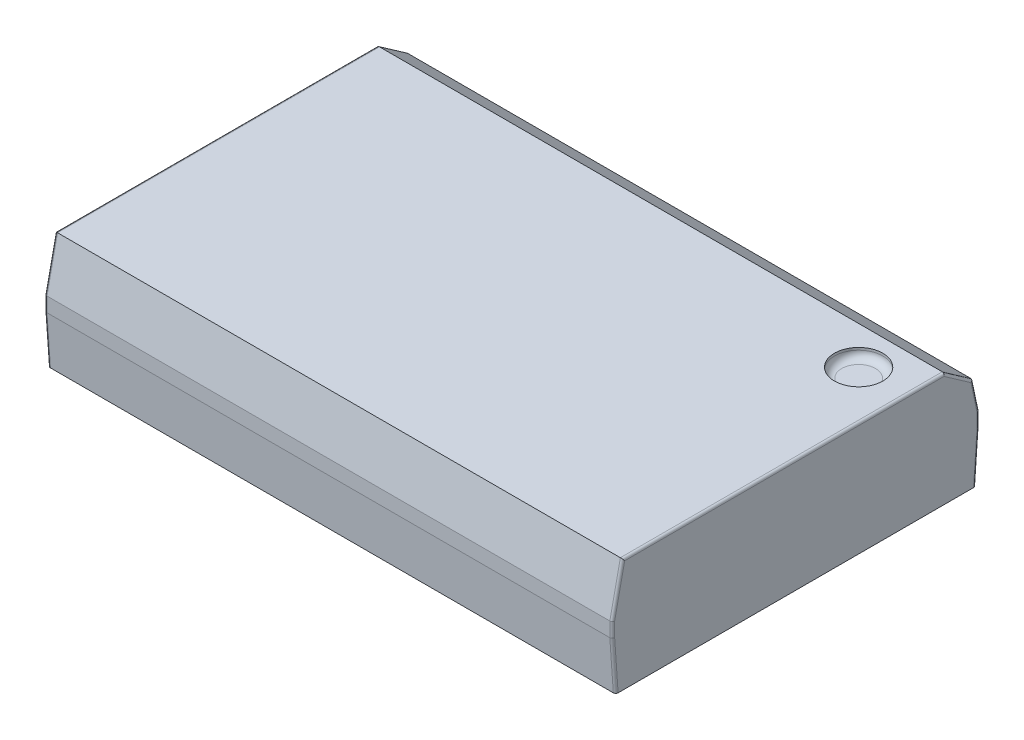
ISO-10303-21;
HEADER;
FILE_DESCRIPTION(('STEP AP214'),'2;1');
FILE_NAME('part.step','',(''),(''),'','','');
FILE_SCHEMA(('AUTOMOTIVE_DESIGN { 1 0 10303 214 1 1 1 1 }'));
ENDSEC;
DATA;
#1=APPLICATION_CONTEXT('core data for automotive mechanical design processes');
#2=APPLICATION_PROTOCOL_DEFINITION('international standard','automotive_design',2000,#1);
#3=PRODUCT_CONTEXT('',#1,'mechanical');
#4=PRODUCT('Part','Part','',(#3));
#5=PRODUCT_RELATED_PRODUCT_CATEGORY('part','',(#4));
#6=PRODUCT_DEFINITION_FORMATION('','',#4);
#7=PRODUCT_DEFINITION_CONTEXT('part definition',#1,'design');
#8=PRODUCT_DEFINITION('design','',#6,#7);
#9=PRODUCT_DEFINITION_SHAPE('','',#8);
#10=(LENGTH_UNIT() NAMED_UNIT(*) SI_UNIT(.MILLI.,.METRE.));
#11=(NAMED_UNIT(*) PLANE_ANGLE_UNIT() SI_UNIT($,.RADIAN.));
#12=(NAMED_UNIT(*) SI_UNIT($,.STERADIAN.) SOLID_ANGLE_UNIT());
#13=UNCERTAINTY_MEASURE_WITH_UNIT(LENGTH_MEASURE(1.E-05),#10,'distance_accuracy_value','');
#14=(GEOMETRIC_REPRESENTATION_CONTEXT(3) GLOBAL_UNCERTAINTY_ASSIGNED_CONTEXT((#13)) GLOBAL_UNIT_ASSIGNED_CONTEXT((#10,
#11,#12)) REPRESENTATION_CONTEXT('',''));
#15=CARTESIAN_POINT('',(0.,0.,0.));
#16=DIRECTION('',(0.,0.,1.));
#17=DIRECTION('',(1.,0.,0.));
#18=AXIS2_PLACEMENT_3D('',#15,#16,#17);
#19=CARTESIAN_POINT('',(4.875,0.975,-2.3));
#20=DIRECTION('',(0.,1.,0.));
#21=DIRECTION('',(0.,0.,1.));
#22=AXIS2_PLACEMENT_3D('',#19,#20,#21);
#23=PLANE('',#22);
#24=CARTESIAN_POINT('',(4.875,0.975,-2.3));
#25=DIRECTION('',(0.,-1.,0.));
#26=DIRECTION('',(0.,0.,-1.));
#27=AXIS2_PLACEMENT_3D('',#24,#25,#26);
#28=CIRCLE('',#27,0.350000000000004);
#29=CARTESIAN_POINT('',(4.875,0.975,-1.95));
#30=VERTEX_POINT('',#29);
#31=CARTESIAN_POINT('',(4.875,0.975,-2.65));
#32=VERTEX_POINT('',#31);
#33=EDGE_CURVE('E294',#30,#32,#28,.F.);
#34=ORIENTED_EDGE('',*,*,#33,.T.);
#35=CARTESIAN_POINT('',(4.875,0.975,-2.3));
#36=DIRECTION('',(0.,-1.,0.));
#37=DIRECTION('',(0.,0.,1.));
#38=AXIS2_PLACEMENT_3D('',#35,#36,#37);
#39=CIRCLE('',#38,0.350000000000003);
#40=EDGE_CURVE('E296',#32,#30,#39,.F.);
#41=ORIENTED_EDGE('',*,*,#40,.T.);
#42=EDGE_LOOP('',(#34,#41));
#43=FACE_BOUND('',#42,.T.);
#44=ADVANCED_FACE('F17',(#43),#23,.T.);
#45=CARTESIAN_POINT('',(4.875,1.125,-2.3));
#46=DIRECTION('',(0.,1.,0.));
#47=DIRECTION('',(0.,0.,1.));
#48=AXIS2_PLACEMENT_3D('',#45,#46,#47);
#49=TOROIDAL_SURFACE('',#48,0.350000000000004,0.15);
#50=CARTESIAN_POINT('',(4.875,1.125,-2.3));
#51=DIRECTION('',(0.,1.,0.));
#52=DIRECTION('',(0.,0.,1.));
#53=AXIS2_PLACEMENT_3D('',#50,#51,#52);
#54=CIRCLE('',#53,0.500000000000003);
#55=CARTESIAN_POINT('',(4.875,1.125,-1.8));
#56=VERTEX_POINT('',#55);
#57=EDGE_CURVE('E213',#56,#56,#54,.T.);
#58=ORIENTED_EDGE('',*,*,#57,.T.);
#59=EDGE_LOOP('',(#58));
#60=FACE_BOUND('',#59,.T.);
#61=ORIENTED_EDGE('',*,*,#40,.F.);
#62=ORIENTED_EDGE('',*,*,#33,.F.);
#63=EDGE_LOOP('',(#61,#62));
#64=FACE_BOUND('',#63,.T.);
#65=ADVANCED_FACE('F217',(#60,#64),#49,.F.);
#66=CARTESIAN_POINT('',(4.875,0.975,-2.3));
#67=DIRECTION('',(0.,1.,0.));
#68=DIRECTION('',(0.,0.,1.));
#69=AXIS2_PLACEMENT_3D('',#66,#67,#68);
#70=CYLINDRICAL_SURFACE('',#69,0.500000000000003);
#71=CARTESIAN_POINT('',(4.875,1.175,-2.3));
#72=DIRECTION('',(0.,1.,0.));
#73=DIRECTION('',(0.,0.,1.));
#74=AXIS2_PLACEMENT_3D('',#71,#72,#73);
#75=CIRCLE('',#74,0.500000000000003);
#76=CARTESIAN_POINT('',(4.875,1.175,-1.8));
#77=VERTEX_POINT('',#76);
#78=EDGE_CURVE('E202',#77,#77,#75,.F.);
#79=ORIENTED_EDGE('',*,*,#78,.F.);
#80=EDGE_LOOP('',(#79));
#81=FACE_BOUND('',#80,.T.);
#82=ORIENTED_EDGE('',*,*,#57,.F.);
#83=EDGE_LOOP('',(#82));
#84=FACE_BOUND('',#83,.T.);
#85=ADVANCED_FACE('F221',(#81,#84),#70,.F.);
#86=CARTESIAN_POINT('',(-5.875,1.175,-3.08212952428822));
#87=DIRECTION('',(0.,0.819152044288992,-0.573576436351045));
#88=DIRECTION('',(0.,0.573576436351045,0.819152044288992));
#89=AXIS2_PLACEMENT_3D('',#86,#87,#88);
#90=PLANE('',#89);
#91=DIRECTION('',(1.,0.,0.));
#92=VECTOR('',#91,1.);
#93=CARTESIAN_POINT('',(-5.875,1.175,-3.08212952428822));
#94=LINE('',#93,#92);
#95=CARTESIAN_POINT('',(5.825,1.175,-3.08212952428822));
#96=VERTEX_POINT('',#95);
#97=CARTESIAN_POINT('',(-5.825,1.175,-3.08212952428822));
#98=VERTEX_POINT('',#97);
#99=EDGE_CURVE('E199',#96,#98,#94,.F.);
#100=ORIENTED_EDGE('',*,*,#99,.F.);
#101=DIRECTION('',(0.,0.573576436351045,0.819152044288992));
#102=VECTOR('',#101,1.);
#103=CARTESIAN_POINT('',(5.825,1.175,-3.08212952428822));
#104=LINE('',#103,#102);
#105=CARTESIAN_POINT('',(5.825,0.763677592272504,-3.66955880101262));
#106=VERTEX_POINT('',#105);
#107=EDGE_CURVE('E208',#96,#106,#104,.F.);
#108=ORIENTED_EDGE('',*,*,#107,.T.);
#109=DIRECTION('',(1.,0.,0.));
#110=VECTOR('',#109,1.);
#111=CARTESIAN_POINT('',(-5.875,0.763677592272504,-3.66955880101262));
#112=LINE('',#111,#110);
#113=CARTESIAN_POINT('',(-5.825,0.763677592272504,-3.66955880101262));
#114=VERTEX_POINT('',#113);
#115=EDGE_CURVE('E137',#106,#114,#112,.F.);
#116=ORIENTED_EDGE('',*,*,#115,.T.);
#117=DIRECTION('',(0.,0.573576436351045,0.819152044288992));
#118=VECTOR('',#117,1.);
#119=CARTESIAN_POINT('',(-5.825,1.175,-3.08212952428822));
#120=LINE('',#119,#118);
#121=EDGE_CURVE('E211',#114,#98,#120,.T.);
#122=ORIENTED_EDGE('',*,*,#121,.T.);
#123=EDGE_LOOP('',(#100,#108,#116,#122));
#124=FACE_BOUND('',#123,.T.);
#125=ADVANCED_FACE('F319',(#124),#90,.T.);
#126=CARTESIAN_POINT('',(-5.875,1.175,-3.58212952428823));
#127=DIRECTION('',(0.,-0.207911690817756,0.978147600733806));
#128=DIRECTION('',(0.,-0.978147600733806,-0.207911690817756));
#129=AXIS2_PLACEMENT_3D('',#126,#127,#128);
#130=PLANE('',#129);
#131=DIRECTION('',(0.,-0.978147600733806,-0.207911690817756));
#132=VECTOR('',#131,1.);
#133=CARTESIAN_POINT('',(-5.825,1.175,-3.58212952428823));
#134=LINE('',#133,#132);
#135=CARTESIAN_POINT('',(-5.825,0.149999999999984,-3.8));
#136=VERTEX_POINT('',#135);
#137=EDGE_CURVE('E205',#114,#136,#134,.T.);
#138=ORIENTED_EDGE('',*,*,#137,.F.);
#139=ORIENTED_EDGE('',*,*,#115,.F.);
#140=DIRECTION('',(0.,-0.978147600733806,-0.207911690817756));
#141=VECTOR('',#140,1.);
#142=CARTESIAN_POINT('',(5.825,1.175,-3.58212952428823));
#143=LINE('',#142,#141);
#144=CARTESIAN_POINT('',(5.825,0.149999999999984,-3.8));
#145=VERTEX_POINT('',#144);
#146=EDGE_CURVE('E130',#145,#106,#143,.F.);
#147=ORIENTED_EDGE('',*,*,#146,.F.);
#148=DIRECTION('',(-1.,0.,0.));
#149=VECTOR('',#148,1.);
#150=CARTESIAN_POINT('',(-5.875,0.149999999999983,-3.8));
#151=LINE('',#150,#149);
#152=EDGE_CURVE('E134',#136,#145,#151,.F.);
#153=ORIENTED_EDGE('',*,*,#152,.F.);
#154=EDGE_LOOP('',(#138,#139,#147,#153));
#155=FACE_BOUND('',#154,.T.);
#156=ADVANCED_FACE('F133',(#155),#130,.F.);
#157=CARTESIAN_POINT('',(-5.875,1.175,3.8));
#158=DIRECTION('',(0.,1.,0.));
#159=DIRECTION('',(0.,0.,1.));
#160=AXIS2_PLACEMENT_3D('',#157,#158,#159);
#161=PLANE('',#160);
#162=DIRECTION('',(1.,0.,0.));
#163=VECTOR('',#162,1.);
#164=CARTESIAN_POINT('',(-5.875,1.175,3.58212952428823));
#165=LINE('',#164,#163);
#166=CARTESIAN_POINT('',(-5.825,1.175,3.58212952428823));
#167=VERTEX_POINT('',#166);
#168=CARTESIAN_POINT('',(5.825,1.175,3.58212952428823));
#169=VERTEX_POINT('',#168);
#170=EDGE_CURVE('E143',#167,#169,#165,.T.);
#171=ORIENTED_EDGE('',*,*,#170,.T.);
#172=DIRECTION('',(0.,0.,-1.));
#173=VECTOR('',#172,1.);
#174=CARTESIAN_POINT('',(5.825,1.175,3.8));
#175=LINE('',#174,#173);
#176=EDGE_CURVE('E188',#96,#169,#175,.F.);
#177=ORIENTED_EDGE('',*,*,#176,.F.);
#178=ORIENTED_EDGE('',*,*,#99,.T.);
#179=DIRECTION('',(0.,0.,1.));
#180=VECTOR('',#179,1.);
#181=CARTESIAN_POINT('',(-5.825,1.175,3.8));
#182=LINE('',#181,#180);
#183=EDGE_CURVE('E280',#167,#98,#182,.F.);
#184=ORIENTED_EDGE('',*,*,#183,.F.);
#185=EDGE_LOOP('',(#171,#177,#178,#184));
#186=FACE_BOUND('',#185,.T.);
#187=ORIENTED_EDGE('',*,*,#78,.T.);
#188=EDGE_LOOP('',(#187));
#189=FACE_BOUND('',#188,.T.);
#190=ADVANCED_FACE('F419',(#186,#189),#161,.T.);
#191=CARTESIAN_POINT('',(-5.875,1.175,3.58212952428823));
#192=DIRECTION('',(0.,-0.207911690817756,-0.978147600733806));
#193=DIRECTION('',(0.,0.978147600733806,-0.207911690817756));
#194=AXIS2_PLACEMENT_3D('',#191,#192,#193);
#195=PLANE('',#194);
#196=DIRECTION('',(0.,-0.978147600733806,0.207911690817756));
#197=VECTOR('',#196,1.);
#198=CARTESIAN_POINT('',(-5.825,0.427875377999794,3.7409357650796));
#199=LINE('',#198,#197);
#200=CARTESIAN_POINT('',(-5.825,0.149999999999984,3.8));
#201=VERTEX_POINT('',#200);
#202=EDGE_CURVE('E166',#201,#167,#199,.F.);
#203=ORIENTED_EDGE('',*,*,#202,.F.);
#204=DIRECTION('',(1.,0.,0.));
#205=VECTOR('',#204,1.);
#206=CARTESIAN_POINT('',(-5.875,0.149999999999983,3.8));
#207=LINE('',#206,#205);
#208=CARTESIAN_POINT('',(5.825,0.149999999999984,3.8));
#209=VERTEX_POINT('',#208);
#210=EDGE_CURVE('E194',#209,#201,#207,.F.);
#211=ORIENTED_EDGE('',*,*,#210,.F.);
#212=DIRECTION('',(0.,0.978147600733806,-0.207911690817756));
#213=VECTOR('',#212,1.);
#214=CARTESIAN_POINT('',(5.825,0.427875377999794,3.7409357650796));
#215=LINE('',#214,#213);
#216=EDGE_CURVE('E160',#169,#209,#215,.F.);
#217=ORIENTED_EDGE('',*,*,#216,.F.);
#218=ORIENTED_EDGE('',*,*,#170,.F.);
#219=EDGE_LOOP('',(#203,#211,#217,#218));
#220=FACE_BOUND('',#219,.T.);
#221=ADVANCED_FACE('F415',(#220),#195,.F.);
#222=CARTESIAN_POINT('',(5.825,-1.175,3.75));
#223=DIRECTION('',(0.,1.,0.));
#224=DIRECTION('',(0.,0.,1.));
#225=AXIS2_PLACEMENT_3D('',#222,#223,#224);
#226=CYLINDRICAL_SURFACE('',#225,0.0500000000000001);
#227=CARTESIAN_POINT('',(5.825,0.144744788236702,3.75));
#228=DIRECTION('',(0.,0.994521895368274,-0.104528463267652));
#229=DIRECTION('',(0.,-0.104528463267652,-0.994521895368274));
#230=AXIS2_PLACEMENT_3D('',#227,#228,#229);
#231=ELLIPSE('',#230,0.0502754139781759,0.0500000000000001);
#232=CARTESIAN_POINT('',(5.875,0.144744788236703,3.75));
#233=VERTEX_POINT('',#232);
#234=EDGE_CURVE('E190',#209,#233,#231,.T.);
#235=ORIENTED_EDGE('',*,*,#234,.F.);
#236=DIRECTION('',(0.,1.,0.));
#237=VECTOR('',#236,1.);
#238=CARTESIAN_POINT('',(5.825,-1.175,3.8));
#239=LINE('',#238,#237);
#240=CARTESIAN_POINT('',(5.825,-0.149999999999958,3.8));
#241=VERTEX_POINT('',#240);
#242=EDGE_CURVE('E266',#241,#209,#239,.T.);
#243=ORIENTED_EDGE('',*,*,#242,.F.);
#244=CARTESIAN_POINT('',(5.825,-0.14825396152536,3.75));
#245=DIRECTION('',(0.,-0.999390827019096,-0.0348994967024995));
#246=DIRECTION('',(0.,0.0348994967024984,-0.999390827019096));
#247=AXIS2_PLACEMENT_3D('',#244,#245,#246);
#248=ELLIPSE('',#247,0.0500304772149412,0.0500000000000001);
#249=CARTESIAN_POINT('',(5.875,-0.148253961525406,3.75));
#250=VERTEX_POINT('',#249);
#251=EDGE_CURVE('E187',#250,#241,#248,.T.);
#252=ORIENTED_EDGE('',*,*,#251,.F.);
#253=DIRECTION('',(0.,1.,0.));
#254=VECTOR('',#253,1.);
#255=CARTESIAN_POINT('',(5.875,-1.175,3.75));
#256=LINE('',#255,#254);
#257=EDGE_CURVE('E185',#233,#250,#256,.F.);
#258=ORIENTED_EDGE('',*,*,#257,.F.);
#259=EDGE_LOOP('',(#235,#243,#252,#258));
#260=FACE_BOUND('',#259,.T.);
#261=ADVANCED_FACE('F412',(#260),#226,.T.);
#262=CARTESIAN_POINT('',(5.825,-1.12811945022911,-4.02055564600102));
#263=DIRECTION('',(0.,-0.978147600733806,-0.207911690817756));
#264=DIRECTION('',(0.,0.207911690817756,-0.978147600733806));
#265=AXIS2_PLACEMENT_3D('',#262,#263,#264);
#266=CYLINDRICAL_SURFACE('',#265,0.0500000000000001);
#267=CARTESIAN_POINT('',(5.825,0.734016878400282,-3.62474635062672));
#268=DIRECTION('',(0.,0.833885822067169,0.551936985312057));
#269=DIRECTION('',(0.,-0.551936985312057,0.833885822067169));
#270=AXIS2_PLACEMENT_3D('',#267,#268,#269);
#271=ELLIPSE('',#270,0.0537393120257227,0.0500000000000001);
#272=CARTESIAN_POINT('',(5.875,0.734016878400282,-3.62474635062672));
#273=VERTEX_POINT('',#272);
#274=EDGE_CURVE('E142',#273,#106,#271,.T.);
#275=ORIENTED_EDGE('',*,*,#274,.F.);
#276=DIRECTION('',(0.,0.978147600733806,0.207911690817757));
#277=VECTOR('',#276,1.);
#278=CARTESIAN_POINT('',(5.875,0.1447447882367,-3.75));
#279=LINE('',#278,#277);
#280=CARTESIAN_POINT('',(5.875,0.144744788236697,-3.75));
#281=VERTEX_POINT('',#280);
#282=EDGE_CURVE('E156',#281,#273,#279,.T.);
#283=ORIENTED_EDGE('',*,*,#282,.F.);
#284=CARTESIAN_POINT('',(5.825,0.1447447882367,-3.75));
#285=DIRECTION('',(0.,0.994521895368274,0.104528463267652));
#286=DIRECTION('',(0.,0.104528463267652,-0.994521895368274));
#287=AXIS2_PLACEMENT_3D('',#284,#285,#286);
#288=ELLIPSE('',#287,0.0502754139781759,0.0500000000000001);
#289=EDGE_CURVE('E152',#145,#281,#288,.F.);
#290=ORIENTED_EDGE('',*,*,#289,.F.);
#291=ORIENTED_EDGE('',*,*,#146,.T.);
#292=EDGE_LOOP('',(#275,#283,#290,#291));
#293=FACE_BOUND('',#292,.T.);
#294=ADVANCED_FACE('F155',(#293),#266,.T.);
#295=CARTESIAN_POINT('',(5.825,0.0236272718400015,-4.63928785124611));
#296=DIRECTION('',(0.,0.573576436351045,0.819152044288992));
#297=DIRECTION('',(0.,-0.819152044288992,0.573576436351045));
#298=AXIS2_PLACEMENT_3D('',#295,#296,#297);
#299=CYLINDRICAL_SURFACE('',#298,0.05);
#300=CARTESIAN_POINT('',(5.825,1.125,-3.06636458484427));
#301=DIRECTION('',(0.,-0.300705799504273,-0.953716950748227));
#302=DIRECTION('',(0.,0.953716950748227,-0.300705799504273));
#303=AXIS2_PLACEMENT_3D('',#300,#301,#302);
#304=ELLIPSE('',#303,0.0524264562570404,0.0499999999999998);
#305=CARTESIAN_POINT('',(5.875,1.125,-3.06636458484427));
#306=VERTEX_POINT('',#305);
#307=EDGE_CURVE('E191',#306,#96,#304,.F.);
#308=ORIENTED_EDGE('',*,*,#307,.F.);
#309=DIRECTION('',(0.,0.573576436351045,0.819152044288992));
#310=VECTOR('',#309,1.);
#311=CARTESIAN_POINT('',(5.875,0.734016878400282,-3.62474635062672));
#312=LINE('',#311,#310);
#313=EDGE_CURVE('E182',#273,#306,#312,.T.);
#314=ORIENTED_EDGE('',*,*,#313,.F.);
#315=ORIENTED_EDGE('',*,*,#274,.T.);
#316=ORIENTED_EDGE('',*,*,#107,.F.);
#317=EDGE_LOOP('',(#308,#314,#315,#316));
#318=FACE_BOUND('',#317,.T.);
#319=ADVANCED_FACE('F405',(#318),#299,.T.);
#320=CARTESIAN_POINT('',(5.825,1.125,3.8));
#321=DIRECTION('',(0.,0.,-1.));
#322=DIRECTION('',(-1.,0.,0.));
#323=AXIS2_PLACEMENT_3D('',#320,#321,#322);
#324=CYLINDRICAL_SURFACE('',#323,0.0499999999999997);
#325=ORIENTED_EDGE('',*,*,#307,.T.);
#326=ORIENTED_EDGE('',*,*,#176,.T.);
#327=CARTESIAN_POINT('',(5.825,1.125,3.54164032262848));
#328=DIRECTION('',(0.,0.629320391049839,-0.77714596145697));
#329=DIRECTION('',(0.,0.77714596145697,0.629320391049839));
#330=AXIS2_PLACEMENT_3D('',#327,#328,#329);
#331=ELLIPSE('',#330,0.0643379782946583,0.0499999999999999);
#332=CARTESIAN_POINT('',(5.875,1.125,3.54164032262848));
#333=VERTEX_POINT('',#332);
#334=EDGE_CURVE('E178',#333,#169,#331,.F.);
#335=ORIENTED_EDGE('',*,*,#334,.F.);
#336=DIRECTION('',(0.,0.,-1.));
#337=VECTOR('',#336,1.);
#338=CARTESIAN_POINT('',(5.875,1.125,-3.8));
#339=LINE('',#338,#337);
#340=EDGE_CURVE('E179',#306,#333,#339,.F.);
#341=ORIENTED_EDGE('',*,*,#340,.F.);
#342=EDGE_LOOP('',(#325,#326,#335,#341));
#343=FACE_BOUND('',#342,.T.);
#344=ADVANCED_FACE('F401',(#343),#324,.T.);
#345=CARTESIAN_POINT('',(5.825,0.417479793458907,3.69202838504291));
#346=DIRECTION('',(0.,0.978147600733806,-0.207911690817756));
#347=DIRECTION('',(0.,0.207911690817756,0.978147600733806));
#348=AXIS2_PLACEMENT_3D('',#345,#346,#347);
#349=CYLINDRICAL_SURFACE('',#348,0.0500000000000001);
#350=ORIENTED_EDGE('',*,*,#334,.T.);
#351=ORIENTED_EDGE('',*,*,#216,.T.);
#352=ORIENTED_EDGE('',*,*,#234,.T.);
#353=DIRECTION('',(0.,-0.978147600733806,0.207911690817756));
#354=VECTOR('',#353,1.);
#355=CARTESIAN_POINT('',(5.875,1.125,3.54164032262848));
#356=LINE('',#355,#354);
#357=EDGE_CURVE('E181',#333,#233,#356,.T.);
#358=ORIENTED_EDGE('',*,*,#357,.F.);
#359=EDGE_LOOP('',(#350,#351,#352,#358));
#360=FACE_BOUND('',#359,.T.);
#361=ADVANCED_FACE('F398',(#360),#349,.T.);
#362=CARTESIAN_POINT('',(5.825,-1.175,-3.75));
#363=DIRECTION('',(0.,1.,0.));
#364=DIRECTION('',(0.,0.,1.));
#365=AXIS2_PLACEMENT_3D('',#362,#363,#364);
#366=CYLINDRICAL_SURFACE('',#365,0.0500000000000001);
#367=ORIENTED_EDGE('',*,*,#289,.T.);
#368=DIRECTION('',(0.,1.,0.));
#369=VECTOR('',#368,1.);
#370=CARTESIAN_POINT('',(5.875,-1.175,-3.75));
#371=LINE('',#370,#369);
#372=CARTESIAN_POINT('',(5.875,-0.148253961525358,-3.75));
#373=VERTEX_POINT('',#372);
#374=EDGE_CURVE('E174',#373,#281,#371,.T.);
#375=ORIENTED_EDGE('',*,*,#374,.F.);
#376=CARTESIAN_POINT('',(5.825,-0.148253961525358,-3.75));
#377=DIRECTION('',(0.,0.999390827019096,-0.0348994967024993));
#378=DIRECTION('',(0.,-0.0348994967024986,-0.999390827019096));
#379=AXIS2_PLACEMENT_3D('',#376,#377,#378);
#380=ELLIPSE('',#379,0.0500304772149412,0.0500000000000001);
#381=CARTESIAN_POINT('',(5.825,-0.149999999999951,-3.8));
#382=VERTEX_POINT('',#381);
#383=EDGE_CURVE('E164',#382,#373,#380,.F.);
#384=ORIENTED_EDGE('',*,*,#383,.F.);
#385=DIRECTION('',(0.,1.,0.));
#386=VECTOR('',#385,1.);
#387=CARTESIAN_POINT('',(5.825,-1.175,-3.8));
#388=LINE('',#387,#386);
#389=EDGE_CURVE('E149',#145,#382,#388,.F.);
#390=ORIENTED_EDGE('',*,*,#389,.F.);
#391=EDGE_LOOP('',(#367,#375,#384,#390));
#392=FACE_BOUND('',#391,.T.);
#393=ADVANCED_FACE('F163',(#392),#366,.T.);
#394=CARTESIAN_POINT('',(-5.875,-1.175,-3.8));
#395=DIRECTION('',(0.,0.,-1.));
#396=DIRECTION('',(-1.,0.,0.));
#397=AXIS2_PLACEMENT_3D('',#394,#395,#396);
#398=PLANE('',#397);
#399=ORIENTED_EDGE('',*,*,#152,.T.);
#400=ORIENTED_EDGE('',*,*,#389,.T.);
#401=DIRECTION('',(1.,0.,0.));
#402=VECTOR('',#401,1.);
#403=CARTESIAN_POINT('',(-5.875,-0.149999999999948,-3.8));
#404=LINE('',#403,#402);
#405=CARTESIAN_POINT('',(-5.825,-0.149999999999947,-3.8));
#406=VERTEX_POINT('',#405);
#407=EDGE_CURVE('E173',#406,#382,#404,.T.);
#408=ORIENTED_EDGE('',*,*,#407,.F.);
#409=DIRECTION('',(0.,1.,0.));
#410=VECTOR('',#409,1.);
#411=CARTESIAN_POINT('',(-5.825,-1.175,-3.8));
#412=LINE('',#411,#410);
#413=EDGE_CURVE('E151',#136,#406,#412,.F.);
#414=ORIENTED_EDGE('',*,*,#413,.F.);
#415=EDGE_LOOP('',(#399,#400,#408,#414));
#416=FACE_BOUND('',#415,.T.);
#417=ADVANCED_FACE('F146',(#416),#398,.T.);
#418=CARTESIAN_POINT('',(-5.825,0.417479793458907,3.69202838504291));
#419=DIRECTION('',(0.,-0.978147600733806,0.207911690817756));
#420=DIRECTION('',(0.,-0.207911690817756,-0.978147600733806));
#421=AXIS2_PLACEMENT_3D('',#418,#419,#420);
#422=CYLINDRICAL_SURFACE('',#421,0.0500000000000001);
#423=CARTESIAN_POINT('',(-5.825,1.125,3.54164032262848));
#424=DIRECTION('',(0.,-0.629320391049839,0.77714596145697));
#425=DIRECTION('',(0.,0.77714596145697,0.629320391049839));
#426=AXIS2_PLACEMENT_3D('',#423,#424,#425);
#427=ELLIPSE('',#426,0.0643379782946583,0.0499999999999999);
#428=CARTESIAN_POINT('',(-5.875,1.125,3.54164032262848));
#429=VERTEX_POINT('',#428);
#430=EDGE_CURVE('E169',#429,#167,#427,.F.);
#431=ORIENTED_EDGE('',*,*,#430,.F.);
#432=DIRECTION('',(0.,0.978147600733806,-0.207911690817757));
#433=VECTOR('',#432,1.);
#434=CARTESIAN_POINT('',(-5.875,0.144744788236702,3.75));
#435=LINE('',#434,#433);
#436=CARTESIAN_POINT('',(-5.875,0.144744788236697,3.75));
#437=VERTEX_POINT('',#436);
#438=EDGE_CURVE('E638',#437,#429,#435,.T.);
#439=ORIENTED_EDGE('',*,*,#438,.F.);
#440=CARTESIAN_POINT('',(-5.825,0.144744788236699,3.75));
#441=DIRECTION('',(0.,0.994521895368274,-0.104528463267652));
#442=DIRECTION('',(0.,0.104528463267652,0.994521895368274));
#443=AXIS2_PLACEMENT_3D('',#440,#441,#442);
#444=ELLIPSE('',#443,0.0502754139781759,0.0500000000000001);
#445=EDGE_CURVE('E197',#201,#437,#444,.F.);
#446=ORIENTED_EDGE('',*,*,#445,.F.);
#447=ORIENTED_EDGE('',*,*,#202,.T.);
#448=EDGE_LOOP('',(#431,#439,#446,#447));
#449=FACE_BOUND('',#448,.T.);
#450=ADVANCED_FACE('F389',(#449),#422,.T.);
#451=CARTESIAN_POINT('',(-5.825,1.125,3.8));
#452=DIRECTION('',(0.,0.,1.));
#453=DIRECTION('',(1.,0.,0.));
#454=AXIS2_PLACEMENT_3D('',#451,#452,#453);
#455=CYLINDRICAL_SURFACE('',#454,0.0499999999999997);
#456=ORIENTED_EDGE('',*,*,#430,.T.);
#457=ORIENTED_EDGE('',*,*,#183,.T.);
#458=CARTESIAN_POINT('',(-5.825,1.125,-3.06636458484427));
#459=DIRECTION('',(0.,-0.300705799504273,-0.953716950748227));
#460=DIRECTION('',(0.,-0.953716950748227,0.300705799504273));
#461=AXIS2_PLACEMENT_3D('',#458,#459,#460);
#462=ELLIPSE('',#461,0.0524264562570404,0.0499999999999998);
#463=CARTESIAN_POINT('',(-5.875,1.125,-3.06636458484427));
#464=VERTEX_POINT('',#463);
#465=EDGE_CURVE('E277',#464,#98,#462,.T.);
#466=ORIENTED_EDGE('',*,*,#465,.F.);
#467=DIRECTION('',(0.,0.,1.));
#468=VECTOR('',#467,1.);
#469=CARTESIAN_POINT('',(-5.875,1.125,-3.8));
#470=LINE('',#469,#468);
#471=EDGE_CURVE('E634',#429,#464,#470,.F.);
#472=ORIENTED_EDGE('',*,*,#471,.F.);
#473=EDGE_LOOP('',(#456,#457,#466,#472));
#474=FACE_BOUND('',#473,.T.);
#475=ADVANCED_FACE('F385',(#474),#455,.T.);
#476=CARTESIAN_POINT('',(-5.825,0.0236272718400015,-4.63928785124611));
#477=DIRECTION('',(0.,-0.573576436351045,-0.819152044288992));
#478=DIRECTION('',(0.,0.819152044288992,-0.573576436351045));
#479=AXIS2_PLACEMENT_3D('',#476,#477,#478);
#480=CYLINDRICAL_SURFACE('',#479,0.05);
#481=ORIENTED_EDGE('',*,*,#465,.T.);
#482=ORIENTED_EDGE('',*,*,#121,.F.);
#483=CARTESIAN_POINT('',(-5.825,0.734016878400282,-3.62474635062672));
#484=DIRECTION('',(0.,0.833885822067169,0.551936985312057));
#485=DIRECTION('',(0.,0.551936985312057,-0.833885822067169));
#486=AXIS2_PLACEMENT_3D('',#483,#484,#485);
#487=ELLIPSE('',#486,0.0537393120257227,0.0500000000000001);
#488=CARTESIAN_POINT('',(-5.875,0.734016878400282,-3.62474635062672));
#489=VERTEX_POINT('',#488);
#490=EDGE_CURVE('E274',#489,#114,#487,.F.);
#491=ORIENTED_EDGE('',*,*,#490,.F.);
#492=DIRECTION('',(0.,-0.573576436351045,-0.819152044288992));
#493=VECTOR('',#492,1.);
#494=CARTESIAN_POINT('',(-5.875,1.125,-3.06636458484427));
#495=LINE('',#494,#493);
#496=EDGE_CURVE('E631',#464,#489,#495,.T.);
#497=ORIENTED_EDGE('',*,*,#496,.F.);
#498=EDGE_LOOP('',(#481,#482,#491,#497));
#499=FACE_BOUND('',#498,.T.);
#500=ADVANCED_FACE('F381',(#499),#480,.T.);
#501=CARTESIAN_POINT('',(-5.825,-1.12811945022911,-4.02055564600102));
#502=DIRECTION('',(0.,0.978147600733806,0.207911690817756));
#503=DIRECTION('',(0.,-0.207911690817756,0.978147600733806));
#504=AXIS2_PLACEMENT_3D('',#501,#502,#503);
#505=CYLINDRICAL_SURFACE('',#504,0.0500000000000001);
#506=ORIENTED_EDGE('',*,*,#490,.T.);
#507=ORIENTED_EDGE('',*,*,#137,.T.);
#508=CARTESIAN_POINT('',(-5.825,0.1447447882367,-3.75));
#509=DIRECTION('',(0.,0.994521895368274,0.104528463267652));
#510=DIRECTION('',(0.,0.104528463267652,-0.994521895368274));
#511=AXIS2_PLACEMENT_3D('',#508,#509,#510);
#512=ELLIPSE('',#511,0.0502754139781759,0.0500000000000001);
#513=CARTESIAN_POINT('',(-5.875,0.144744788236699,-3.75));
#514=VERTEX_POINT('',#513);
#515=EDGE_CURVE('E271',#514,#136,#512,.F.);
#516=ORIENTED_EDGE('',*,*,#515,.F.);
#517=DIRECTION('',(0.,-0.978147600733806,-0.207911690817756));
#518=VECTOR('',#517,1.);
#519=CARTESIAN_POINT('',(-5.875,0.734016878400282,-3.62474635062672));
#520=LINE('',#519,#518);
#521=EDGE_CURVE('E633',#489,#514,#520,.T.);
#522=ORIENTED_EDGE('',*,*,#521,.F.);
#523=EDGE_LOOP('',(#506,#507,#516,#522));
#524=FACE_BOUND('',#523,.T.);
#525=ADVANCED_FACE('F377',(#524),#505,.T.);
#526=CARTESIAN_POINT('',(-5.825,-1.175,-3.75));
#527=DIRECTION('',(0.,1.,0.));
#528=DIRECTION('',(0.,0.,1.));
#529=AXIS2_PLACEMENT_3D('',#526,#527,#528);
#530=CYLINDRICAL_SURFACE('',#529,0.0500000000000001);
#531=ORIENTED_EDGE('',*,*,#515,.T.);
#532=ORIENTED_EDGE('',*,*,#413,.T.);
#533=CARTESIAN_POINT('',(-5.825,-0.148253961525358,-3.75));
#534=DIRECTION('',(0.,-0.999390827019096,0.0348994967024993));
#535=DIRECTION('',(0.,0.0348994967024986,0.999390827019096));
#536=AXIS2_PLACEMENT_3D('',#533,#534,#535);
#537=ELLIPSE('',#536,0.0500304772149412,0.0500000000000001);
#538=CARTESIAN_POINT('',(-5.875,-0.148253961525387,-3.75));
#539=VERTEX_POINT('',#538);
#540=EDGE_CURVE('E258',#539,#406,#537,.T.);
#541=ORIENTED_EDGE('',*,*,#540,.F.);
#542=DIRECTION('',(0.,1.,0.));
#543=VECTOR('',#542,1.);
#544=CARTESIAN_POINT('',(-5.875,-1.175,-3.75));
#545=LINE('',#544,#543);
#546=EDGE_CURVE('E636',#514,#539,#545,.F.);
#547=ORIENTED_EDGE('',*,*,#546,.F.);
#548=EDGE_LOOP('',(#531,#532,#541,#547));
#549=FACE_BOUND('',#548,.T.);
#550=ADVANCED_FACE('F373',(#549),#530,.T.);
#551=CARTESIAN_POINT('',(-5.825,-1.175,3.75));
#552=DIRECTION('',(0.,1.,0.));
#553=DIRECTION('',(0.,0.,1.));
#554=AXIS2_PLACEMENT_3D('',#551,#552,#553);
#555=CYLINDRICAL_SURFACE('',#554,0.0500000000000001);
#556=ORIENTED_EDGE('',*,*,#445,.T.);
#557=DIRECTION('',(0.,1.,0.));
#558=VECTOR('',#557,1.);
#559=CARTESIAN_POINT('',(-5.875,-1.175,3.75));
#560=LINE('',#559,#558);
#561=CARTESIAN_POINT('',(-5.875,-0.148253961525383,3.75));
#562=VERTEX_POINT('',#561);
#563=EDGE_CURVE('E642',#562,#437,#560,.T.);
#564=ORIENTED_EDGE('',*,*,#563,.F.);
#565=CARTESIAN_POINT('',(-5.825,-0.148253961525382,3.75));
#566=DIRECTION('',(0.,0.999390827019096,0.0348994967024995));
#567=DIRECTION('',(0.,-0.0348994967024984,0.999390827019096));
#568=AXIS2_PLACEMENT_3D('',#565,#566,#567);
#569=ELLIPSE('',#568,0.0500304772149412,0.0500000000000001);
#570=CARTESIAN_POINT('',(-5.825,-0.149999999999959,3.8));
#571=VERTEX_POINT('',#570);
#572=EDGE_CURVE('E254',#571,#562,#569,.F.);
#573=ORIENTED_EDGE('',*,*,#572,.F.);
#574=DIRECTION('',(0.,1.,0.));
#575=VECTOR('',#574,1.);
#576=CARTESIAN_POINT('',(-5.825,-1.175,3.8));
#577=LINE('',#576,#575);
#578=EDGE_CURVE('E196',#201,#571,#577,.F.);
#579=ORIENTED_EDGE('',*,*,#578,.F.);
#580=EDGE_LOOP('',(#556,#564,#573,#579));
#581=FACE_BOUND('',#580,.T.);
#582=ADVANCED_FACE('F369',(#581),#555,.T.);
#583=CARTESIAN_POINT('',(-5.875,-1.175,3.8));
#584=DIRECTION('',(0.,0.,1.));
#585=DIRECTION('',(1.,0.,0.));
#586=AXIS2_PLACEMENT_3D('',#583,#584,#585);
#587=PLANE('',#586);
#588=DIRECTION('',(1.,0.,0.));
#589=VECTOR('',#588,1.);
#590=CARTESIAN_POINT('',(-5.875,-0.149999999999948,3.8));
#591=LINE('',#590,#589);
#592=EDGE_CURVE('E253',#241,#571,#591,.F.);
#593=ORIENTED_EDGE('',*,*,#592,.F.);
#594=ORIENTED_EDGE('',*,*,#242,.T.);
#595=ORIENTED_EDGE('',*,*,#210,.T.);
#596=ORIENTED_EDGE('',*,*,#578,.T.);
#597=EDGE_LOOP('',(#593,#594,#595,#596));
#598=FACE_BOUND('',#597,.T.);
#599=ADVANCED_FACE('F365',(#598),#587,.T.);
#600=CARTESIAN_POINT('',(5.825,-1.69538234519108,3.64181424446295));
#601=DIRECTION('',(0.,-0.997564050259825,-0.0697564737441223));
#602=DIRECTION('',(0.,0.0697564737441223,-0.997564050259825));
#603=AXIS2_PLACEMENT_3D('',#600,#601,#602);
#604=CYLINDRICAL_SURFACE('',#603,0.0500000000000001);
#605=ORIENTED_EDGE('',*,*,#251,.T.);
#606=DIRECTION('',(0.,-0.997564050259825,-0.0697564737441223));
#607=VECTOR('',#606,1.);
#608=CARTESIAN_POINT('',(5.825,-0.149999999999948,3.8));
#609=LINE('',#608,#607);
#610=CARTESIAN_POINT('',(5.825,-1.175,3.7283250177579));
#611=VERTEX_POINT('',#610);
#612=EDGE_CURVE('E251',#611,#241,#609,.F.);
#613=ORIENTED_EDGE('',*,*,#612,.F.);
#614=CARTESIAN_POINT('',(5.825,-1.175,3.67820292285384));
#615=DIRECTION('',(0.,1.,0.));
#616=DIRECTION('',(0.,0.,-1.));
#617=AXIS2_PLACEMENT_3D('',#614,#615,#616);
#618=ELLIPSE('',#617,0.0501220949040587,0.0500000000000001);
#619=CARTESIAN_POINT('',(5.875,-1.175,3.67820292285384));
#620=VERTEX_POINT('',#619);
#621=EDGE_CURVE('E248',#611,#620,#618,.T.);
#622=ORIENTED_EDGE('',*,*,#621,.T.);
#623=DIRECTION('',(0.,-0.997564050259825,-0.0697564737441231));
#624=VECTOR('',#623,1.);
#625=CARTESIAN_POINT('',(5.875,-0.148253961525367,3.75));
#626=LINE('',#625,#624);
#627=EDGE_CURVE('E176',#250,#620,#626,.T.);
#628=ORIENTED_EDGE('',*,*,#627,.F.);
#629=EDGE_LOOP('',(#605,#613,#622,#628));
#630=FACE_BOUND('',#629,.T.);
#631=ADVANCED_FACE('F361',(#630),#604,.T.);
#632=CARTESIAN_POINT('',(5.875,-1.175,-3.8));
#633=DIRECTION('',(1.,0.,0.));
#634=DIRECTION('',(0.,0.,-1.));
#635=AXIS2_PLACEMENT_3D('',#632,#633,#634);
#636=PLANE('',#635);
#637=ORIENTED_EDGE('',*,*,#340,.T.);
#638=ORIENTED_EDGE('',*,*,#357,.T.);
#639=ORIENTED_EDGE('',*,*,#257,.T.);
#640=ORIENTED_EDGE('',*,*,#627,.T.);
#641=DIRECTION('',(0.,0.,1.));
#642=VECTOR('',#641,1.);
#643=CARTESIAN_POINT('',(5.875,-1.175,3.8));
#644=LINE('',#643,#642);
#645=CARTESIAN_POINT('',(5.875,-1.175,-3.67820292285384));
#646=VERTEX_POINT('',#645);
#647=EDGE_CURVE('E247',#620,#646,#644,.F.);
#648=ORIENTED_EDGE('',*,*,#647,.T.);
#649=DIRECTION('',(0.,0.997564050259825,-0.0697564737441219));
#650=VECTOR('',#649,1.);
#651=CARTESIAN_POINT('',(5.875,-1.16652456154285,-3.67879558324497));
#652=LINE('',#651,#650);
#653=EDGE_CURVE('E264',#373,#646,#652,.F.);
#654=ORIENTED_EDGE('',*,*,#653,.F.);
#655=ORIENTED_EDGE('',*,*,#374,.T.);
#656=ORIENTED_EDGE('',*,*,#282,.T.);
#657=ORIENTED_EDGE('',*,*,#313,.T.);
#658=EDGE_LOOP('',(#637,#638,#639,#640,#648,#654,#655,#656,#657));
#659=FACE_BOUND('',#658,.T.);
#660=ADVANCED_FACE('F357',(#659),#636,.T.);
#661=CARTESIAN_POINT('',(5.825,-1.16652456154285,-3.67879558324497));
#662=DIRECTION('',(0.,0.997564050259825,-0.0697564737441219));
#663=DIRECTION('',(0.,0.0697564737441219,0.997564050259825));
#664=AXIS2_PLACEMENT_3D('',#661,#662,#663);
#665=CYLINDRICAL_SURFACE('',#664,0.0500000000000001);
#666=ORIENTED_EDGE('',*,*,#383,.T.);
#667=ORIENTED_EDGE('',*,*,#653,.T.);
#668=CARTESIAN_POINT('',(5.825,-1.175,-3.67820292285384));
#669=DIRECTION('',(0.,1.,0.));
#670=DIRECTION('',(0.,0.,-1.));
#671=AXIS2_PLACEMENT_3D('',#668,#669,#670);
#672=ELLIPSE('',#671,0.0501220949040587,0.0500000000000001);
#673=CARTESIAN_POINT('',(5.825,-1.175,-3.7283250177579));
#674=VERTEX_POINT('',#673);
#675=EDGE_CURVE('E244',#646,#674,#672,.T.);
#676=ORIENTED_EDGE('',*,*,#675,.T.);
#677=DIRECTION('',(0.,0.997564050259825,-0.0697564737441219));
#678=VECTOR('',#677,1.);
#679=CARTESIAN_POINT('',(5.825,-0.149999999999948,-3.8));
#680=LINE('',#679,#678);
#681=EDGE_CURVE('E262',#382,#674,#680,.F.);
#682=ORIENTED_EDGE('',*,*,#681,.F.);
#683=EDGE_LOOP('',(#666,#667,#676,#682));
#684=FACE_BOUND('',#683,.T.);
#685=ADVANCED_FACE('F353',(#684),#665,.T.);
#686=CARTESIAN_POINT('',(-5.875,-0.149999999999948,-3.8));
#687=DIRECTION('',(0.,-0.0697564737441219,-0.997564050259825));
#688=DIRECTION('',(0.,0.997564050259825,-0.0697564737441219));
#689=AXIS2_PLACEMENT_3D('',#686,#687,#688);
#690=PLANE('',#689);
#691=ORIENTED_EDGE('',*,*,#407,.T.);
#692=ORIENTED_EDGE('',*,*,#681,.T.);
#693=DIRECTION('',(1.,0.,0.));
#694=VECTOR('',#693,1.);
#695=CARTESIAN_POINT('',(-5.875,-1.175,-3.7283250177579));
#696=LINE('',#695,#694);
#697=CARTESIAN_POINT('',(-5.825,-1.175,-3.7283250177579));
#698=VERTEX_POINT('',#697);
#699=EDGE_CURVE('E243',#674,#698,#696,.F.);
#700=ORIENTED_EDGE('',*,*,#699,.T.);
#701=DIRECTION('',(0.,-0.997564050259825,0.0697564737441219));
#702=VECTOR('',#701,1.);
#703=CARTESIAN_POINT('',(-5.825,-1.17001238523006,-3.72867378575797));
#704=LINE('',#703,#702);
#705=EDGE_CURVE('E261',#406,#698,#704,.T.);
#706=ORIENTED_EDGE('',*,*,#705,.F.);
#707=EDGE_LOOP('',(#691,#692,#700,#706));
#708=FACE_BOUND('',#707,.T.);
#709=ADVANCED_FACE('F349',(#708),#690,.T.);
#710=CARTESIAN_POINT('',(-5.825,-1.16652456154285,-3.67879558324497));
#711=DIRECTION('',(0.,-0.997564050259825,0.0697564737441219));
#712=DIRECTION('',(0.,-0.0697564737441219,-0.997564050259825));
#713=AXIS2_PLACEMENT_3D('',#710,#711,#712);
#714=CYLINDRICAL_SURFACE('',#713,0.0500000000000001);
#715=ORIENTED_EDGE('',*,*,#540,.T.);
#716=ORIENTED_EDGE('',*,*,#705,.T.);
#717=CARTESIAN_POINT('',(-5.825,-1.175,-3.67820292285384));
#718=DIRECTION('',(0.,1.,0.));
#719=DIRECTION('',(0.,0.,1.));
#720=AXIS2_PLACEMENT_3D('',#717,#718,#719);
#721=ELLIPSE('',#720,0.0501220949040587,0.0500000000000001);
#722=CARTESIAN_POINT('',(-5.875,-1.175,-3.67820292285384));
#723=VERTEX_POINT('',#722);
#724=EDGE_CURVE('E240',#698,#723,#721,.T.);
#725=ORIENTED_EDGE('',*,*,#724,.T.);
#726=DIRECTION('',(0.,-0.997564050259825,0.0697564737441218));
#727=VECTOR('',#726,1.);
#728=CARTESIAN_POINT('',(-5.875,-0.148253961525361,-3.75));
#729=LINE('',#728,#727);
#730=EDGE_CURVE('E257',#539,#723,#729,.T.);
#731=ORIENTED_EDGE('',*,*,#730,.F.);
#732=EDGE_LOOP('',(#715,#716,#725,#731));
#733=FACE_BOUND('',#732,.T.);
#734=ADVANCED_FACE('F345',(#733),#714,.T.);
#735=CARTESIAN_POINT('',(-5.875,-1.175,-3.8));
#736=DIRECTION('',(-1.,0.,0.));
#737=DIRECTION('',(0.,0.,1.));
#738=AXIS2_PLACEMENT_3D('',#735,#736,#737);
#739=PLANE('',#738);
#740=ORIENTED_EDGE('',*,*,#546,.T.);
#741=ORIENTED_EDGE('',*,*,#730,.T.);
#742=DIRECTION('',(0.,0.,1.));
#743=VECTOR('',#742,1.);
#744=CARTESIAN_POINT('',(-5.875,-1.175,3.8));
#745=LINE('',#744,#743);
#746=CARTESIAN_POINT('',(-5.875,-1.175,3.67820292285384));
#747=VERTEX_POINT('',#746);
#748=EDGE_CURVE('E239',#723,#747,#745,.T.);
#749=ORIENTED_EDGE('',*,*,#748,.T.);
#750=DIRECTION('',(0.,0.997564050259825,0.0697564737441223));
#751=VECTOR('',#750,1.);
#752=CARTESIAN_POINT('',(-5.875,-1.69538234519108,3.64181424446295));
#753=LINE('',#752,#751);
#754=EDGE_CURVE('E256',#562,#747,#753,.F.);
#755=ORIENTED_EDGE('',*,*,#754,.F.);
#756=ORIENTED_EDGE('',*,*,#563,.T.);
#757=ORIENTED_EDGE('',*,*,#438,.T.);
#758=ORIENTED_EDGE('',*,*,#471,.T.);
#759=ORIENTED_EDGE('',*,*,#496,.T.);
#760=ORIENTED_EDGE('',*,*,#521,.T.);
#761=EDGE_LOOP('',(#740,#741,#749,#755,#756,#757,#758,#759,#760));
#762=FACE_BOUND('',#761,.T.);
#763=ADVANCED_FACE('F341',(#762),#739,.T.);
#764=CARTESIAN_POINT('',(-5.825,-1.69538234519108,3.64181424446295));
#765=DIRECTION('',(0.,0.997564050259825,0.0697564737441223));
#766=DIRECTION('',(0.,-0.0697564737441223,0.997564050259825));
#767=AXIS2_PLACEMENT_3D('',#764,#765,#766);
#768=CYLINDRICAL_SURFACE('',#767,0.0500000000000001);
#769=ORIENTED_EDGE('',*,*,#572,.T.);
#770=ORIENTED_EDGE('',*,*,#754,.T.);
#771=CARTESIAN_POINT('',(-5.825,-1.175,3.67820292285384));
#772=DIRECTION('',(0.,1.,0.));
#773=DIRECTION('',(0.,0.,1.));
#774=AXIS2_PLACEMENT_3D('',#771,#772,#773);
#775=ELLIPSE('',#774,0.0501220949040587,0.0500000000000001);
#776=CARTESIAN_POINT('',(-5.825,-1.175,3.7283250177579));
#777=VERTEX_POINT('',#776);
#778=EDGE_CURVE('E28',#747,#777,#775,.T.);
#779=ORIENTED_EDGE('',*,*,#778,.T.);
#780=DIRECTION('',(0.,-0.997564050259825,-0.0697564737441223));
#781=VECTOR('',#780,1.);
#782=CARTESIAN_POINT('',(-5.825,-0.149999999999948,3.8));
#783=LINE('',#782,#781);
#784=EDGE_CURVE('E36',#571,#777,#783,.T.);
#785=ORIENTED_EDGE('',*,*,#784,.F.);
#786=EDGE_LOOP('',(#769,#770,#779,#785));
#787=FACE_BOUND('',#786,.T.);
#788=ADVANCED_FACE('F335',(#787),#768,.T.);
#789=CARTESIAN_POINT('',(-5.875,-0.149999999999948,3.8));
#790=DIRECTION('',(0.,-0.0697564737441223,0.997564050259825));
#791=DIRECTION('',(0.,-0.997564050259825,-0.0697564737441223));
#792=AXIS2_PLACEMENT_3D('',#789,#790,#791);
#793=PLANE('',#792);
#794=DIRECTION('',(1.,0.,0.));
#795=VECTOR('',#794,1.);
#796=CARTESIAN_POINT('',(-5.875,-1.175,3.7283250177579));
#797=LINE('',#796,#795);
#798=EDGE_CURVE('E10',#777,#611,#797,.T.);
#799=ORIENTED_EDGE('',*,*,#798,.T.);
#800=ORIENTED_EDGE('',*,*,#612,.T.);
#801=ORIENTED_EDGE('',*,*,#592,.T.);
#802=ORIENTED_EDGE('',*,*,#784,.T.);
#803=EDGE_LOOP('',(#799,#800,#801,#802));
#804=FACE_BOUND('',#803,.T.);
#805=ADVANCED_FACE('F329',(#804),#793,.T.);
#806=CARTESIAN_POINT('',(-5.875,-1.175,3.8));
#807=DIRECTION('',(0.,1.,0.));
#808=DIRECTION('',(0.,0.,1.));
#809=AXIS2_PLACEMENT_3D('',#806,#807,#808);
#810=PLANE('',#809);
#811=ORIENTED_EDGE('',*,*,#778,.F.);
#812=ORIENTED_EDGE('',*,*,#748,.F.);
#813=ORIENTED_EDGE('',*,*,#724,.F.);
#814=ORIENTED_EDGE('',*,*,#699,.F.);
#815=ORIENTED_EDGE('',*,*,#675,.F.);
#816=ORIENTED_EDGE('',*,*,#647,.F.);
#817=ORIENTED_EDGE('',*,*,#621,.F.);
#818=ORIENTED_EDGE('',*,*,#798,.F.);
#819=EDGE_LOOP('',(#811,#812,#813,#814,#815,#816,#817,#818));
#820=FACE_BOUND('',#819,.T.);
#821=ADVANCED_FACE('F327',(#820),#810,.F.);
#822=CLOSED_SHELL('',(#44,#65,#85,#125,#156,#190,#221,#261,#294,#319,#344,#361,#393,#417,#450,
#475,#500,#525,#550,#582,#599,#631,#660,#685,#709,#734,#763,#788,#805,#821));
#823=MANIFOLD_SOLID_BREP('B1',#822);
#824=ADVANCED_BREP_SHAPE_REPRESENTATION('',(#18,#823),#14);
#825=SHAPE_DEFINITION_REPRESENTATION(#9,#824);
ENDSEC;
END-ISO-10303-21;
